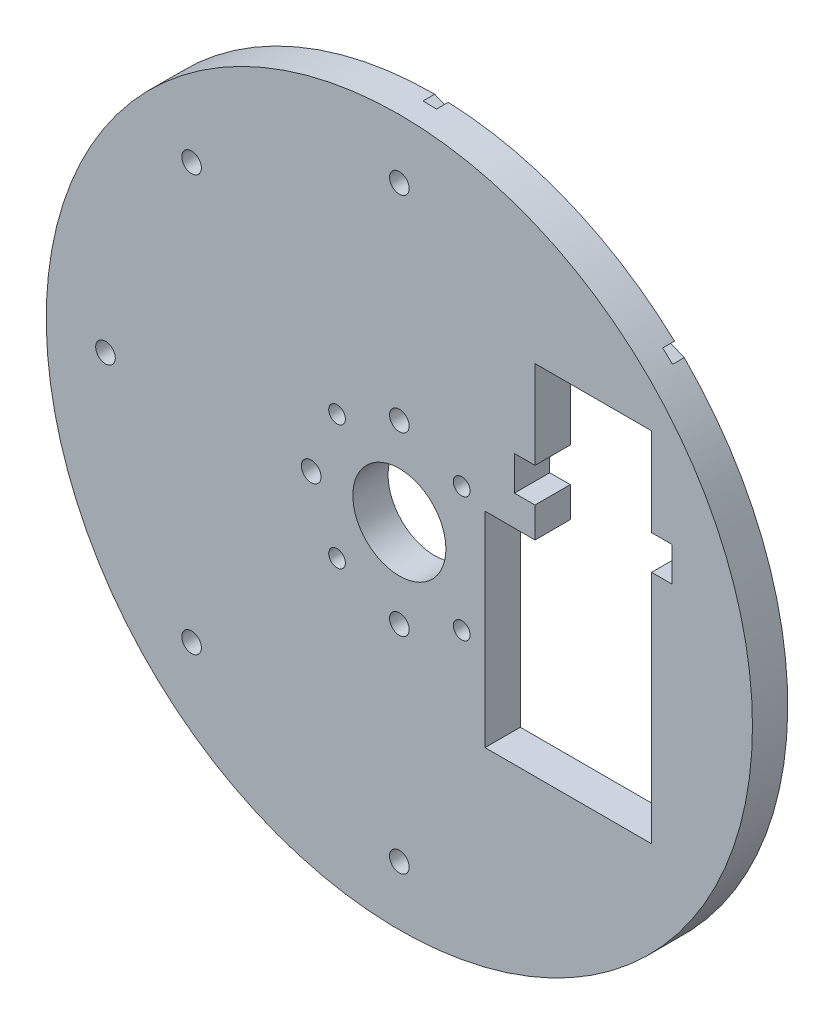
ISO-10303-21;
HEADER;
FILE_DESCRIPTION(('STEP AP214'),'2;1');
FILE_NAME('part.step','',(''),(''),'','','');
FILE_SCHEMA(('AUTOMOTIVE_DESIGN { 1 0 10303 214 1 1 1 1 }'));
ENDSEC;
DATA;
#1=APPLICATION_CONTEXT('core data for automotive mechanical design processes');
#2=APPLICATION_PROTOCOL_DEFINITION('international standard','automotive_design',2000,#1);
#3=PRODUCT_CONTEXT('',#1,'mechanical');
#4=PRODUCT('Part','Part','',(#3));
#5=PRODUCT_RELATED_PRODUCT_CATEGORY('part','',(#4));
#6=PRODUCT_DEFINITION_FORMATION('','',#4);
#7=PRODUCT_DEFINITION_CONTEXT('part definition',#1,'design');
#8=PRODUCT_DEFINITION('design','',#6,#7);
#9=PRODUCT_DEFINITION_SHAPE('','',#8);
#10=(LENGTH_UNIT() NAMED_UNIT(*) SI_UNIT(.MILLI.,.METRE.));
#11=(NAMED_UNIT(*) PLANE_ANGLE_UNIT() SI_UNIT($,.RADIAN.));
#12=(NAMED_UNIT(*) SI_UNIT($,.STERADIAN.) SOLID_ANGLE_UNIT());
#13=UNCERTAINTY_MEASURE_WITH_UNIT(LENGTH_MEASURE(1.E-05),#10,'distance_accuracy_value','');
#14=(GEOMETRIC_REPRESENTATION_CONTEXT(3) GLOBAL_UNCERTAINTY_ASSIGNED_CONTEXT((#13)) GLOBAL_UNIT_ASSIGNED_CONTEXT((#10,
#11,#12)) REPRESENTATION_CONTEXT('',''));
#15=CARTESIAN_POINT('',(0.,0.,0.));
#16=DIRECTION('',(0.,0.,1.));
#17=DIRECTION('',(1.,0.,0.));
#18=AXIS2_PLACEMENT_3D('',#15,#16,#17);
#19=CARTESIAN_POINT('',(0.,0.,0.));
#20=DIRECTION('',(0.,0.,1.));
#21=DIRECTION('',(1.,0.,0.));
#22=AXIS2_PLACEMENT_3D('',#19,#20,#21);
#23=PLANE('',#22);
#24=CARTESIAN_POINT('',(0.,0.,0.));
#25=DIRECTION('',(0.,0.,1.));
#26=DIRECTION('',(1.,0.,0.));
#27=AXIS2_PLACEMENT_3D('',#24,#25,#26);
#28=CIRCLE('',#27,60.08);
#29=CARTESIAN_POINT('',(40.8115144155926,44.0911180523456,0.));
#30=VERTEX_POINT('',#29);
#31=CARTESIAN_POINT('',(2.31902997115174,60.0352271586683,0.));
#32=VERTEX_POINT('',#31);
#33=EDGE_CURVE('E198',#30,#32,#28,.T.);
#34=ORIENTED_EDGE('',*,*,#33,.F.);
#35=DIRECTION('',(0.923879532511288,-0.382683432365087,0.));
#36=VECTOR('',#35,1.);
#37=CARTESIAN_POINT('',(42.7119362037879,43.3039375734458,0.));
#38=LINE('',#37,#36);
#39=EDGE_CURVE('E766',#32,#30,#38,.T.);
#40=ORIENTED_EDGE('',*,*,#39,.F.);
#41=EDGE_LOOP('',(#34,#40));
#42=FACE_BOUND('',#41,.T.);
#43=ADVANCED_FACE('F33',(#42),#23,.F.);
#44=CARTESIAN_POINT('',(0.,0.,6.));
#45=DIRECTION('',(0.,0.,1.));
#46=DIRECTION('',(1.,0.,0.));
#47=AXIS2_PLACEMENT_3D('',#44,#45,#46);
#48=PLANE('',#47);
#49=DIRECTION('',(0.,-1.,0.));
#50=VECTOR('',#49,1.);
#51=CARTESIAN_POINT('',(42.92,-26.,6.));
#52=LINE('',#51,#50);
#53=CARTESIAN_POINT('',(42.92,14.08,6.));
#54=VERTEX_POINT('',#53);
#55=CARTESIAN_POINT('',(42.92,-25.92,6.));
#56=VERTEX_POINT('',#55);
#57=EDGE_CURVE('E173',#54,#56,#52,.T.);
#58=ORIENTED_EDGE('',*,*,#57,.T.);
#59=DIRECTION('',(-1.,0.,0.));
#60=VECTOR('',#59,1.);
#61=CARTESIAN_POINT('',(23.,-25.92,6.));
#62=LINE('',#61,#60);
#63=CARTESIAN_POINT('',(14.58,-25.92,6.));
#64=VERTEX_POINT('',#63);
#65=EDGE_CURVE('E180',#56,#64,#62,.T.);
#66=ORIENTED_EDGE('',*,*,#65,.T.);
#67=DIRECTION('',(0.,1.,0.));
#68=VECTOR('',#67,1.);
#69=CARTESIAN_POINT('',(14.58,9.00000000000001,6.));
#70=LINE('',#69,#68);
#71=CARTESIAN_POINT('',(14.58,8.92000000000001,6.));
#72=VERTEX_POINT('',#71);
#73=EDGE_CURVE('E278',#64,#72,#70,.T.);
#74=ORIENTED_EDGE('',*,*,#73,.T.);
#75=DIRECTION('',(1.,0.,0.));
#76=VECTOR('',#75,1.);
#77=CARTESIAN_POINT('',(23.,8.92,6.));
#78=LINE('',#77,#76);
#79=CARTESIAN_POINT('',(23.08,8.92,6.));
#80=VERTEX_POINT('',#79);
#81=EDGE_CURVE('E281',#72,#80,#78,.T.);
#82=ORIENTED_EDGE('',*,*,#81,.T.);
#83=DIRECTION('',(0.,1.,0.));
#84=VECTOR('',#83,1.);
#85=CARTESIAN_POINT('',(23.08,9.,6.));
#86=LINE('',#85,#84);
#87=CARTESIAN_POINT('',(23.08,14.08,6.));
#88=VERTEX_POINT('',#87);
#89=EDGE_CURVE('E284',#80,#88,#86,.T.);
#90=ORIENTED_EDGE('',*,*,#89,.T.);
#91=DIRECTION('',(-1.,0.,0.));
#92=VECTOR('',#91,1.);
#93=CARTESIAN_POINT('',(23.,14.08,6.));
#94=LINE('',#93,#92);
#95=CARTESIAN_POINT('',(19.58,14.08,6.));
#96=VERTEX_POINT('',#95);
#97=EDGE_CURVE('E287',#88,#96,#94,.T.);
#98=ORIENTED_EDGE('',*,*,#97,.T.);
#99=DIRECTION('',(0.,1.,0.));
#100=VECTOR('',#99,1.);
#101=CARTESIAN_POINT('',(19.58,14.,6.));
#102=LINE('',#101,#100);
#103=CARTESIAN_POINT('',(19.58,19.92,6.));
#104=VERTEX_POINT('',#103);
#105=EDGE_CURVE('E290',#96,#104,#102,.T.);
#106=ORIENTED_EDGE('',*,*,#105,.T.);
#107=DIRECTION('',(1.,0.,0.));
#108=VECTOR('',#107,1.);
#109=CARTESIAN_POINT('',(19.5,19.92,6.));
#110=LINE('',#109,#108);
#111=CARTESIAN_POINT('',(23.08,19.92,6.));
#112=VERTEX_POINT('',#111);
#113=EDGE_CURVE('E293',#104,#112,#110,.T.);
#114=ORIENTED_EDGE('',*,*,#113,.T.);
#115=DIRECTION('',(0.,1.,0.));
#116=VECTOR('',#115,1.);
#117=CARTESIAN_POINT('',(23.08,20.,6.));
#118=LINE('',#117,#116);
#119=CARTESIAN_POINT('',(23.08,34.92,6.));
#120=VERTEX_POINT('',#119);
#121=EDGE_CURVE('E296',#112,#120,#118,.T.);
#122=ORIENTED_EDGE('',*,*,#121,.T.);
#123=DIRECTION('',(1.,0.,0.));
#124=VECTOR('',#123,1.);
#125=CARTESIAN_POINT('',(23.,34.92,6.));
#126=LINE('',#125,#124);
#127=CARTESIAN_POINT('',(42.92,34.92,6.));
#128=VERTEX_POINT('',#127);
#129=EDGE_CURVE('E299',#120,#128,#126,.T.);
#130=ORIENTED_EDGE('',*,*,#129,.T.);
#131=DIRECTION('',(0.,-1.,0.));
#132=VECTOR('',#131,1.);
#133=CARTESIAN_POINT('',(42.92,35.,6.));
#134=LINE('',#133,#132);
#135=CARTESIAN_POINT('',(42.92,19.92,6.));
#136=VERTEX_POINT('',#135);
#137=EDGE_CURVE('E302',#128,#136,#134,.T.);
#138=ORIENTED_EDGE('',*,*,#137,.T.);
#139=DIRECTION('',(1.,0.,0.));
#140=VECTOR('',#139,1.);
#141=CARTESIAN_POINT('',(43.,19.92,6.));
#142=LINE('',#141,#140);
#143=CARTESIAN_POINT('',(46.42,19.92,6.));
#144=VERTEX_POINT('',#143);
#145=EDGE_CURVE('E189',#136,#144,#142,.T.);
#146=ORIENTED_EDGE('',*,*,#145,.T.);
#147=DIRECTION('',(0.,-1.,0.));
#148=VECTOR('',#147,1.);
#149=CARTESIAN_POINT('',(46.42,20.,6.));
#150=LINE('',#149,#148);
#151=CARTESIAN_POINT('',(46.42,14.08,6.));
#152=VERTEX_POINT('',#151);
#153=EDGE_CURVE('E185',#144,#152,#150,.T.);
#154=ORIENTED_EDGE('',*,*,#153,.T.);
#155=DIRECTION('',(-1.,0.,0.));
#156=VECTOR('',#155,1.);
#157=CARTESIAN_POINT('',(46.5,14.08,6.));
#158=LINE('',#157,#156);
#159=EDGE_CURVE('E164',#152,#54,#158,.T.);
#160=ORIENTED_EDGE('',*,*,#159,.T.);
#161=EDGE_LOOP('',(#58,#66,#74,#82,#90,#98,#106,#114,#122,#130,#138,#146,#154,#160));
#162=FACE_BOUND('',#161,.T.);
#163=CARTESIAN_POINT('',(-35.3553390593272,35.3553390593276,6.));
#164=DIRECTION('',(0.,0.,1.));
#165=DIRECTION('',(1.,0.,0.));
#166=AXIS2_PLACEMENT_3D('',#163,#164,#165);
#167=CIRCLE('',#166,1.67);
#168=CARTESIAN_POINT('',(-33.6853390593272,35.3553390593276,6.));
#169=VERTEX_POINT('',#168);
#170=EDGE_CURVE('E396',#169,#169,#167,.T.);
#171=ORIENTED_EDGE('',*,*,#170,.F.);
#172=EDGE_LOOP('',(#171));
#173=FACE_BOUND('',#172,.T.);
#174=CARTESIAN_POINT('',(10.6066017177983,10.6066017177981,6.));
#175=DIRECTION('',(0.,0.,1.));
#176=DIRECTION('',(1.,0.,0.));
#177=AXIS2_PLACEMENT_3D('',#174,#175,#176);
#178=CIRCLE('',#177,1.42);
#179=CARTESIAN_POINT('',(12.0266017177983,10.6066017177981,6.));
#180=VERTEX_POINT('',#179);
#181=EDGE_CURVE('E404',#180,#180,#178,.T.);
#182=ORIENTED_EDGE('',*,*,#181,.F.);
#183=EDGE_LOOP('',(#182));
#184=FACE_BOUND('',#183,.T.);
#185=CARTESIAN_POINT('',(1.04744440165294E-13,15.,6.));
#186=DIRECTION('',(0.,0.,1.));
#187=DIRECTION('',(1.,0.,0.));
#188=AXIS2_PLACEMENT_3D('',#185,#186,#187);
#189=CIRCLE('',#188,1.67);
#190=CARTESIAN_POINT('',(1.6700000000001,15.,6.));
#191=VERTEX_POINT('',#190);
#192=EDGE_CURVE('E412',#191,#191,#189,.T.);
#193=ORIENTED_EDGE('',*,*,#192,.F.);
#194=EDGE_LOOP('',(#193));
#195=FACE_BOUND('',#194,.T.);
#196=CARTESIAN_POINT('',(-15.,0.,6.));
#197=DIRECTION('',(0.,0.,1.));
#198=DIRECTION('',(1.,0.,0.));
#199=AXIS2_PLACEMENT_3D('',#196,#197,#198);
#200=CIRCLE('',#199,1.67);
#201=CARTESIAN_POINT('',(-13.33,0.,6.));
#202=VERTEX_POINT('',#201);
#203=EDGE_CURVE('E420',#202,#202,#200,.T.);
#204=ORIENTED_EDGE('',*,*,#203,.F.);
#205=EDGE_LOOP('',(#204));
#206=FACE_BOUND('',#205,.T.);
#207=CARTESIAN_POINT('',(0.,-50.,6.));
#208=DIRECTION('',(0.,0.,1.));
#209=DIRECTION('',(1.,0.,0.));
#210=AXIS2_PLACEMENT_3D('',#207,#208,#209);
#211=CIRCLE('',#210,1.67);
#212=CARTESIAN_POINT('',(1.67,-50.,6.));
#213=VERTEX_POINT('',#212);
#214=EDGE_CURVE('E428',#213,#213,#211,.T.);
#215=ORIENTED_EDGE('',*,*,#214,.F.);
#216=EDGE_LOOP('',(#215));
#217=FACE_BOUND('',#216,.T.);
#218=CARTESIAN_POINT('',(0.,-15.,6.));
#219=DIRECTION('',(0.,0.,1.));
#220=DIRECTION('',(1.,0.,0.));
#221=AXIS2_PLACEMENT_3D('',#218,#219,#220);
#222=CIRCLE('',#221,1.67);
#223=CARTESIAN_POINT('',(1.67,-15.,6.));
#224=VERTEX_POINT('',#223);
#225=EDGE_CURVE('E201',#224,#224,#222,.T.);
#226=ORIENTED_EDGE('',*,*,#225,.F.);
#227=EDGE_LOOP('',(#226));
#228=FACE_BOUND('',#227,.T.);
#229=CARTESIAN_POINT('',(0.,0.,6.));
#230=DIRECTION('',(0.,0.,1.));
#231=DIRECTION('',(1.,0.,0.));
#232=AXIS2_PLACEMENT_3D('',#229,#230,#231);
#233=CIRCLE('',#232,60.08);
#234=CARTESIAN_POINT('',(60.08,0.,6.));
#235=VERTEX_POINT('',#234);
#236=EDGE_CURVE('E781',#235,#235,#233,.T.);
#237=ORIENTED_EDGE('',*,*,#236,.T.);
#238=EDGE_LOOP('',(#237));
#239=FACE_BOUND('',#238,.T.);
#240=CARTESIAN_POINT('',(0.,0.,6.));
#241=DIRECTION('',(0.,0.,1.));
#242=DIRECTION('',(1.,0.,0.));
#243=AXIS2_PLACEMENT_3D('',#240,#241,#242);
#244=CIRCLE('',#243,7.92);
#245=CARTESIAN_POINT('',(7.92,0.,6.));
#246=VERTEX_POINT('',#245);
#247=EDGE_CURVE('E192',#246,#246,#244,.T.);
#248=ORIENTED_EDGE('',*,*,#247,.F.);
#249=EDGE_LOOP('',(#248));
#250=FACE_BOUND('',#249,.T.);
#251=CARTESIAN_POINT('',(10.6066017177982,-10.6066017177982,6.));
#252=DIRECTION('',(0.,0.,1.));
#253=DIRECTION('',(1.,0.,0.));
#254=AXIS2_PLACEMENT_3D('',#251,#252,#253);
#255=CIRCLE('',#254,1.42);
#256=CARTESIAN_POINT('',(12.0266017177982,-10.6066017177982,6.));
#257=VERTEX_POINT('',#256);
#258=EDGE_CURVE('E210',#257,#257,#255,.T.);
#259=ORIENTED_EDGE('',*,*,#258,.F.);
#260=EDGE_LOOP('',(#259));
#261=FACE_BOUND('',#260,.T.);
#262=CARTESIAN_POINT('',(-35.3553390593274,-35.3553390593273,6.));
#263=DIRECTION('',(0.,0.,1.));
#264=DIRECTION('',(1.,0.,0.));
#265=AXIS2_PLACEMENT_3D('',#262,#263,#264);
#266=CIRCLE('',#265,1.67);
#267=CARTESIAN_POINT('',(-33.6853390593274,-35.3553390593273,6.));
#268=VERTEX_POINT('',#267);
#269=EDGE_CURVE('E424',#268,#268,#266,.T.);
#270=ORIENTED_EDGE('',*,*,#269,.F.);
#271=EDGE_LOOP('',(#270));
#272=FACE_BOUND('',#271,.T.);
#273=CARTESIAN_POINT('',(-10.6066017177982,-10.6066017177982,6.));
#274=DIRECTION('',(0.,0.,1.));
#275=DIRECTION('',(1.,0.,0.));
#276=AXIS2_PLACEMENT_3D('',#273,#274,#275);
#277=CIRCLE('',#276,1.42);
#278=CARTESIAN_POINT('',(-9.18660171779823,-10.6066017177982,6.));
#279=VERTEX_POINT('',#278);
#280=EDGE_CURVE('E416',#279,#279,#277,.T.);
#281=ORIENTED_EDGE('',*,*,#280,.F.);
#282=EDGE_LOOP('',(#281));
#283=FACE_BOUND('',#282,.T.);
#284=CARTESIAN_POINT('',(-10.6066017177982,10.6066017177983,6.));
#285=DIRECTION('',(0.,0.,1.));
#286=DIRECTION('',(1.,0.,0.));
#287=AXIS2_PLACEMENT_3D('',#284,#285,#286);
#288=CIRCLE('',#287,1.42);
#289=CARTESIAN_POINT('',(-9.18660171779816,10.6066017177983,6.));
#290=VERTEX_POINT('',#289);
#291=EDGE_CURVE('E408',#290,#290,#288,.T.);
#292=ORIENTED_EDGE('',*,*,#291,.F.);
#293=EDGE_LOOP('',(#292));
#294=FACE_BOUND('',#293,.T.);
#295=CARTESIAN_POINT('',(-50.,1.74574066942157E-13,6.));
#296=DIRECTION('',(0.,0.,1.));
#297=DIRECTION('',(1.,0.,0.));
#298=AXIS2_PLACEMENT_3D('',#295,#296,#297);
#299=CIRCLE('',#298,1.67);
#300=CARTESIAN_POINT('',(-48.33,1.74574066942157E-13,6.));
#301=VERTEX_POINT('',#300);
#302=EDGE_CURVE('E400',#301,#301,#299,.T.);
#303=ORIENTED_EDGE('',*,*,#302,.F.);
#304=EDGE_LOOP('',(#303));
#305=FACE_BOUND('',#304,.T.);
#306=CARTESIAN_POINT('',(1.68358407260694E-13,50.,6.));
#307=DIRECTION('',(0.,0.,1.));
#308=DIRECTION('',(1.,0.,0.));
#309=AXIS2_PLACEMENT_3D('',#306,#307,#308);
#310=CIRCLE('',#309,1.67);
#311=CARTESIAN_POINT('',(1.67000000000017,50.,6.));
#312=VERTEX_POINT('',#311);
#313=EDGE_CURVE('E390',#312,#312,#310,.T.);
#314=ORIENTED_EDGE('',*,*,#313,.F.);
#315=EDGE_LOOP('',(#314));
#316=FACE_BOUND('',#315,.T.);
#317=ADVANCED_FACE('F182',(#162,#173,#184,#195,#206,#217,#228,#239,#250,#261,#272,#283,#294,
#305,#316),#48,.T.);
#318=DIRECTION('',(-1.,0.,0.));
#319=VECTOR('',#318,1.);
#320=CARTESIAN_POINT('',(23.,-25.92,0.));
#321=LINE('',#320,#319);
#322=CARTESIAN_POINT('',(42.92,-25.92,0.));
#323=VERTEX_POINT('',#322);
#324=CARTESIAN_POINT('',(14.58,-25.92,0.));
#325=VERTEX_POINT('',#324);
#326=EDGE_CURVE('E240',#323,#325,#321,.T.);
#327=ORIENTED_EDGE('',*,*,#326,.F.);
#328=DIRECTION('',(0.,-1.,0.));
#329=VECTOR('',#328,1.);
#330=CARTESIAN_POINT('',(42.92,-26.,0.));
#331=LINE('',#330,#329);
#332=CARTESIAN_POINT('',(42.92,14.08,0.));
#333=VERTEX_POINT('',#332);
#334=EDGE_CURVE('E238',#333,#323,#331,.T.);
#335=ORIENTED_EDGE('',*,*,#334,.F.);
#336=DIRECTION('',(-1.,0.,0.));
#337=VECTOR('',#336,1.);
#338=CARTESIAN_POINT('',(46.5,14.08,0.));
#339=LINE('',#338,#337);
#340=CARTESIAN_POINT('',(46.42,14.08,0.));
#341=VERTEX_POINT('',#340);
#342=EDGE_CURVE('E167',#341,#333,#339,.T.);
#343=ORIENTED_EDGE('',*,*,#342,.F.);
#344=DIRECTION('',(0.,-1.,0.));
#345=VECTOR('',#344,1.);
#346=CARTESIAN_POINT('',(46.42,20.,0.));
#347=LINE('',#346,#345);
#348=CARTESIAN_POINT('',(46.42,19.92,0.));
#349=VERTEX_POINT('',#348);
#350=EDGE_CURVE('E243',#349,#341,#347,.T.);
#351=ORIENTED_EDGE('',*,*,#350,.F.);
#352=DIRECTION('',(1.,0.,0.));
#353=VECTOR('',#352,1.);
#354=CARTESIAN_POINT('',(43.,19.92,0.));
#355=LINE('',#354,#353);
#356=CARTESIAN_POINT('',(42.92,19.92,0.));
#357=VERTEX_POINT('',#356);
#358=EDGE_CURVE('E245',#357,#349,#355,.T.);
#359=ORIENTED_EDGE('',*,*,#358,.F.);
#360=DIRECTION('',(0.,-1.,0.));
#361=VECTOR('',#360,1.);
#362=CARTESIAN_POINT('',(42.92,35.,0.));
#363=LINE('',#362,#361);
#364=CARTESIAN_POINT('',(42.92,34.92,0.));
#365=VERTEX_POINT('',#364);
#366=EDGE_CURVE('E248',#365,#357,#363,.T.);
#367=ORIENTED_EDGE('',*,*,#366,.F.);
#368=DIRECTION('',(1.,0.,0.));
#369=VECTOR('',#368,1.);
#370=CARTESIAN_POINT('',(23.,34.92,0.));
#371=LINE('',#370,#369);
#372=CARTESIAN_POINT('',(23.08,34.92,0.));
#373=VERTEX_POINT('',#372);
#374=EDGE_CURVE('E251',#373,#365,#371,.T.);
#375=ORIENTED_EDGE('',*,*,#374,.F.);
#376=DIRECTION('',(0.,1.,0.));
#377=VECTOR('',#376,1.);
#378=CARTESIAN_POINT('',(23.08,20.,0.));
#379=LINE('',#378,#377);
#380=CARTESIAN_POINT('',(23.08,19.92,0.));
#381=VERTEX_POINT('',#380);
#382=EDGE_CURVE('E254',#381,#373,#379,.T.);
#383=ORIENTED_EDGE('',*,*,#382,.F.);
#384=DIRECTION('',(1.,0.,0.));
#385=VECTOR('',#384,1.);
#386=CARTESIAN_POINT('',(19.5,19.92,0.));
#387=LINE('',#386,#385);
#388=CARTESIAN_POINT('',(19.58,19.92,0.));
#389=VERTEX_POINT('',#388);
#390=EDGE_CURVE('E257',#389,#381,#387,.T.);
#391=ORIENTED_EDGE('',*,*,#390,.F.);
#392=DIRECTION('',(0.,1.,0.));
#393=VECTOR('',#392,1.);
#394=CARTESIAN_POINT('',(19.58,14.,0.));
#395=LINE('',#394,#393);
#396=CARTESIAN_POINT('',(19.58,14.08,0.));
#397=VERTEX_POINT('',#396);
#398=EDGE_CURVE('E260',#397,#389,#395,.T.);
#399=ORIENTED_EDGE('',*,*,#398,.F.);
#400=DIRECTION('',(-1.,0.,0.));
#401=VECTOR('',#400,1.);
#402=CARTESIAN_POINT('',(23.,14.08,0.));
#403=LINE('',#402,#401);
#404=CARTESIAN_POINT('',(23.08,14.08,0.));
#405=VERTEX_POINT('',#404);
#406=EDGE_CURVE('E263',#405,#397,#403,.T.);
#407=ORIENTED_EDGE('',*,*,#406,.F.);
#408=DIRECTION('',(0.,1.,0.));
#409=VECTOR('',#408,1.);
#410=CARTESIAN_POINT('',(23.08,9.,0.));
#411=LINE('',#410,#409);
#412=CARTESIAN_POINT('',(23.08,8.92,0.));
#413=VERTEX_POINT('',#412);
#414=EDGE_CURVE('E266',#413,#405,#411,.T.);
#415=ORIENTED_EDGE('',*,*,#414,.F.);
#416=DIRECTION('',(1.,0.,0.));
#417=VECTOR('',#416,1.);
#418=CARTESIAN_POINT('',(23.,8.92,0.));
#419=LINE('',#418,#417);
#420=CARTESIAN_POINT('',(14.58,8.92000000000001,0.));
#421=VERTEX_POINT('',#420);
#422=EDGE_CURVE('E269',#421,#413,#419,.T.);
#423=ORIENTED_EDGE('',*,*,#422,.F.);
#424=DIRECTION('',(0.,1.,0.));
#425=VECTOR('',#424,1.);
#426=CARTESIAN_POINT('',(14.58,9.00000000000001,0.));
#427=LINE('',#426,#425);
#428=EDGE_CURVE('E272',#325,#421,#427,.T.);
#429=ORIENTED_EDGE('',*,*,#428,.F.);
#430=EDGE_LOOP('',(#327,#335,#343,#351,#359,#367,#375,#383,#391,#399,#407,#415,#423,#429));
#431=FACE_BOUND('',#430,.T.);
#432=CARTESIAN_POINT('',(-35.3553390593272,35.3553390593276,0.));
#433=DIRECTION('',(0.,0.,1.));
#434=DIRECTION('',(1.,0.,0.));
#435=AXIS2_PLACEMENT_3D('',#432,#433,#434);
#436=CIRCLE('',#435,1.67);
#437=CARTESIAN_POINT('',(-33.6853390593272,35.3553390593276,0.));
#438=VERTEX_POINT('',#437);
#439=EDGE_CURVE('E346',#438,#438,#436,.T.);
#440=ORIENTED_EDGE('',*,*,#439,.T.);
#441=EDGE_LOOP('',(#440));
#442=FACE_BOUND('',#441,.T.);
#443=CARTESIAN_POINT('',(10.6066017177983,10.6066017177981,0.));
#444=DIRECTION('',(0.,0.,1.));
#445=DIRECTION('',(1.,0.,0.));
#446=AXIS2_PLACEMENT_3D('',#443,#444,#445);
#447=CIRCLE('',#446,1.42);
#448=CARTESIAN_POINT('',(12.0266017177983,10.6066017177981,0.));
#449=VERTEX_POINT('',#448);
#450=EDGE_CURVE('E350',#449,#449,#447,.T.);
#451=ORIENTED_EDGE('',*,*,#450,.T.);
#452=EDGE_LOOP('',(#451));
#453=FACE_BOUND('',#452,.T.);
#454=CARTESIAN_POINT('',(1.04744440165294E-13,15.,0.));
#455=DIRECTION('',(0.,0.,1.));
#456=DIRECTION('',(1.,0.,0.));
#457=AXIS2_PLACEMENT_3D('',#454,#455,#456);
#458=CIRCLE('',#457,1.67);
#459=CARTESIAN_POINT('',(1.6700000000001,15.,0.));
#460=VERTEX_POINT('',#459);
#461=EDGE_CURVE('E354',#460,#460,#458,.T.);
#462=ORIENTED_EDGE('',*,*,#461,.T.);
#463=EDGE_LOOP('',(#462));
#464=FACE_BOUND('',#463,.T.);
#465=CARTESIAN_POINT('',(-15.,0.,0.));
#466=DIRECTION('',(0.,0.,1.));
#467=DIRECTION('',(1.,0.,0.));
#468=AXIS2_PLACEMENT_3D('',#465,#466,#467);
#469=CIRCLE('',#468,1.67);
#470=CARTESIAN_POINT('',(-13.33,0.,0.));
#471=VERTEX_POINT('',#470);
#472=EDGE_CURVE('E358',#471,#471,#469,.T.);
#473=ORIENTED_EDGE('',*,*,#472,.T.);
#474=EDGE_LOOP('',(#473));
#475=FACE_BOUND('',#474,.T.);
#476=CARTESIAN_POINT('',(0.,-50.,0.));
#477=DIRECTION('',(0.,0.,1.));
#478=DIRECTION('',(1.,0.,0.));
#479=AXIS2_PLACEMENT_3D('',#476,#477,#478);
#480=CIRCLE('',#479,1.67);
#481=CARTESIAN_POINT('',(1.67,-50.,0.));
#482=VERTEX_POINT('',#481);
#483=EDGE_CURVE('E362',#482,#482,#480,.T.);
#484=ORIENTED_EDGE('',*,*,#483,.T.);
#485=EDGE_LOOP('',(#484));
#486=FACE_BOUND('',#485,.T.);
#487=CARTESIAN_POINT('',(0.,-15.,0.));
#488=DIRECTION('',(0.,0.,1.));
#489=DIRECTION('',(1.,0.,0.));
#490=AXIS2_PLACEMENT_3D('',#487,#488,#489);
#491=CIRCLE('',#490,1.67);
#492=CARTESIAN_POINT('',(1.67,-15.,0.));
#493=VERTEX_POINT('',#492);
#494=EDGE_CURVE('E205',#493,#493,#491,.T.);
#495=ORIENTED_EDGE('',*,*,#494,.T.);
#496=EDGE_LOOP('',(#495));
#497=FACE_BOUND('',#496,.T.);
#498=CARTESIAN_POINT('',(0.,0.,0.));
#499=DIRECTION('',(0.,0.,1.));
#500=DIRECTION('',(1.,0.,0.));
#501=AXIS2_PLACEMENT_3D('',#498,#499,#500);
#502=CIRCLE('',#501,60.08);
#503=CARTESIAN_POINT('',(0.015918080320763,60.0799978912676,0.));
#504=VERTEX_POINT('',#503);
#505=CARTESIAN_POINT('',(42.4717181400503,42.4942297051273,0.));
#506=VERTEX_POINT('',#505);
#507=EDGE_CURVE('E194',#504,#506,#502,.T.);
#508=ORIENTED_EDGE('',*,*,#507,.F.);
#509=DIRECTION('',(-0.923879532511288,0.382683432365087,0.));
#510=VECTOR('',#509,1.);
#511=CARTESIAN_POINT('',(42.4570215457818,42.500317233794,0.));
#512=LINE('',#511,#510);
#513=EDGE_CURVE('E761',#506,#504,#512,.T.);
#514=ORIENTED_EDGE('',*,*,#513,.F.);
#515=EDGE_LOOP('',(#508,#514));
#516=FACE_BOUND('',#515,.T.);
#517=CARTESIAN_POINT('',(0.,0.,0.));
#518=DIRECTION('',(0.,0.,1.));
#519=DIRECTION('',(1.,0.,0.));
#520=AXIS2_PLACEMENT_3D('',#517,#518,#519);
#521=CIRCLE('',#520,7.92);
#522=CARTESIAN_POINT('',(7.92,0.,0.));
#523=VERTEX_POINT('',#522);
#524=EDGE_CURVE('E37',#523,#523,#521,.T.);
#525=ORIENTED_EDGE('',*,*,#524,.T.);
#526=EDGE_LOOP('',(#525));
#527=FACE_BOUND('',#526,.T.);
#528=CARTESIAN_POINT('',(10.6066017177982,-10.6066017177982,0.));
#529=DIRECTION('',(0.,0.,1.));
#530=DIRECTION('',(1.,0.,0.));
#531=AXIS2_PLACEMENT_3D('',#528,#529,#530);
#532=CIRCLE('',#531,1.42);
#533=CARTESIAN_POINT('',(12.0266017177982,-10.6066017177982,0.));
#534=VERTEX_POINT('',#533);
#535=EDGE_CURVE('E213',#534,#534,#532,.T.);
#536=ORIENTED_EDGE('',*,*,#535,.T.);
#537=EDGE_LOOP('',(#536));
#538=FACE_BOUND('',#537,.T.);
#539=CARTESIAN_POINT('',(-35.3553390593274,-35.3553390593273,0.));
#540=DIRECTION('',(0.,0.,1.));
#541=DIRECTION('',(1.,0.,0.));
#542=AXIS2_PLACEMENT_3D('',#539,#540,#541);
#543=CIRCLE('',#542,1.67);
#544=CARTESIAN_POINT('',(-33.6853390593274,-35.3553390593273,0.));
#545=VERTEX_POINT('',#544);
#546=EDGE_CURVE('E374',#545,#545,#543,.T.);
#547=ORIENTED_EDGE('',*,*,#546,.T.);
#548=EDGE_LOOP('',(#547));
#549=FACE_BOUND('',#548,.T.);
#550=CARTESIAN_POINT('',(-10.6066017177982,-10.6066017177982,0.));
#551=DIRECTION('',(0.,0.,1.));
#552=DIRECTION('',(1.,0.,0.));
#553=AXIS2_PLACEMENT_3D('',#550,#551,#552);
#554=CIRCLE('',#553,1.42);
#555=CARTESIAN_POINT('',(-9.18660171779823,-10.6066017177982,0.));
#556=VERTEX_POINT('',#555);
#557=EDGE_CURVE('E378',#556,#556,#554,.T.);
#558=ORIENTED_EDGE('',*,*,#557,.T.);
#559=EDGE_LOOP('',(#558));
#560=FACE_BOUND('',#559,.T.);
#561=CARTESIAN_POINT('',(-10.6066017177982,10.6066017177983,0.));
#562=DIRECTION('',(0.,0.,1.));
#563=DIRECTION('',(1.,0.,0.));
#564=AXIS2_PLACEMENT_3D('',#561,#562,#563);
#565=CIRCLE('',#564,1.42);
#566=CARTESIAN_POINT('',(-9.18660171779816,10.6066017177983,0.));
#567=VERTEX_POINT('',#566);
#568=EDGE_CURVE('E382',#567,#567,#565,.T.);
#569=ORIENTED_EDGE('',*,*,#568,.T.);
#570=EDGE_LOOP('',(#569));
#571=FACE_BOUND('',#570,.T.);
#572=CARTESIAN_POINT('',(-50.,1.74574066942157E-13,0.));
#573=DIRECTION('',(0.,0.,1.));
#574=DIRECTION('',(1.,0.,0.));
#575=AXIS2_PLACEMENT_3D('',#572,#573,#574);
#576=CIRCLE('',#575,1.67);
#577=CARTESIAN_POINT('',(-48.33,1.74574066942157E-13,0.));
#578=VERTEX_POINT('',#577);
#579=EDGE_CURVE('E386',#578,#578,#576,.T.);
#580=ORIENTED_EDGE('',*,*,#579,.T.);
#581=EDGE_LOOP('',(#580));
#582=FACE_BOUND('',#581,.T.);
#583=CARTESIAN_POINT('',(1.68358407260694E-13,50.,0.));
#584=DIRECTION('',(0.,0.,1.));
#585=DIRECTION('',(1.,0.,0.));
#586=AXIS2_PLACEMENT_3D('',#583,#584,#585);
#587=CIRCLE('',#586,1.67);
#588=CARTESIAN_POINT('',(1.67000000000017,50.,0.));
#589=VERTEX_POINT('',#588);
#590=EDGE_CURVE('E170',#589,#589,#587,.T.);
#591=ORIENTED_EDGE('',*,*,#590,.T.);
#592=EDGE_LOOP('',(#591));
#593=FACE_BOUND('',#592,.T.);
#594=ADVANCED_FACE('F325',(#431,#442,#453,#464,#475,#486,#497,#516,#527,#538,#549,#560,#571,
#582,#593),#23,.F.);
#595=CARTESIAN_POINT('',(0.,0.,6.));
#596=DIRECTION('',(0.,0.,-1.));
#597=DIRECTION('',(-1.,0.,0.));
#598=AXIS2_PLACEMENT_3D('',#595,#596,#597);
#599=CYLINDRICAL_SURFACE('',#598,60.08);
#600=CARTESIAN_POINT('',(0.,0.,2.));
#601=DIRECTION('',(0.,0.,1.));
#602=DIRECTION('',(1.,0.,0.));
#603=AXIS2_PLACEMENT_3D('',#600,#601,#602);
#604=CIRCLE('',#603,60.08);
#605=CARTESIAN_POINT('',(42.4717181400503,42.4942297051273,2.));
#606=VERTEX_POINT('',#605);
#607=CARTESIAN_POINT('',(40.8115144155926,44.0911180523456,2.));
#608=VERTEX_POINT('',#607);
#609=EDGE_CURVE('E43',#606,#608,#604,.T.);
#610=ORIENTED_EDGE('',*,*,#609,.T.);
#611=DIRECTION('',(0.,0.,-1.));
#612=VECTOR('',#611,1.);
#613=CARTESIAN_POINT('',(40.8115144155926,44.0911180523456,2.));
#614=LINE('',#613,#612);
#615=EDGE_CURVE('E12',#608,#30,#614,.T.);
#616=ORIENTED_EDGE('',*,*,#615,.T.);
#617=ORIENTED_EDGE('',*,*,#33,.T.);
#618=DIRECTION('',(0.,0.,-1.));
#619=VECTOR('',#618,1.);
#620=CARTESIAN_POINT('',(2.31902997115174,60.0352271586683,0.));
#621=LINE('',#620,#619);
#622=CARTESIAN_POINT('',(2.31902997115174,60.0352271586683,2.));
#623=VERTEX_POINT('',#622);
#624=EDGE_CURVE('E776',#32,#623,#621,.F.);
#625=ORIENTED_EDGE('',*,*,#624,.T.);
#626=CARTESIAN_POINT('',(0.,0.,2.));
#627=DIRECTION('',(0.,0.,1.));
#628=DIRECTION('',(1.,0.,0.));
#629=AXIS2_PLACEMENT_3D('',#626,#627,#628);
#630=CIRCLE('',#629,60.08);
#631=CARTESIAN_POINT('',(0.0159180803207651,60.0799978912676,2.));
#632=VERTEX_POINT('',#631);
#633=EDGE_CURVE('E771',#623,#632,#630,.T.);
#634=ORIENTED_EDGE('',*,*,#633,.T.);
#635=DIRECTION('',(0.,0.,-1.));
#636=VECTOR('',#635,1.);
#637=CARTESIAN_POINT('',(0.0159180803207651,60.0799978912676,2.));
#638=LINE('',#637,#636);
#639=EDGE_CURVE('E241',#632,#504,#638,.T.);
#640=ORIENTED_EDGE('',*,*,#639,.T.);
#641=ORIENTED_EDGE('',*,*,#507,.T.);
#642=DIRECTION('',(0.,0.,-1.));
#643=VECTOR('',#642,1.);
#644=CARTESIAN_POINT('',(42.4717181400503,42.4942297051273,2.));
#645=LINE('',#644,#643);
#646=EDGE_CURVE('E765',#606,#506,#645,.T.);
#647=ORIENTED_EDGE('',*,*,#646,.F.);
#648=EDGE_LOOP('',(#610,#616,#617,#625,#634,#640,#641,#647));
#649=FACE_BOUND('',#648,.T.);
#650=ORIENTED_EDGE('',*,*,#236,.F.);
#651=EDGE_LOOP('',(#650));
#652=FACE_BOUND('',#651,.T.);
#653=ADVANCED_FACE('F333',(#649,#652),#599,.T.);
#654=CARTESIAN_POINT('',(0.,0.,6.));
#655=DIRECTION('',(0.,0.,-1.));
#656=DIRECTION('',(-1.,0.,0.));
#657=AXIS2_PLACEMENT_3D('',#654,#655,#656);
#658=CYLINDRICAL_SURFACE('',#657,7.92);
#659=ORIENTED_EDGE('',*,*,#247,.T.);
#660=EDGE_LOOP('',(#659));
#661=FACE_BOUND('',#660,.T.);
#662=ORIENTED_EDGE('',*,*,#524,.F.);
#663=EDGE_LOOP('',(#662));
#664=FACE_BOUND('',#663,.T.);
#665=ADVANCED_FACE('F338',(#661,#664),#658,.F.);
#666=CARTESIAN_POINT('',(0.,-15.,6.));
#667=DIRECTION('',(0.,0.,-1.));
#668=DIRECTION('',(-1.,0.,0.));
#669=AXIS2_PLACEMENT_3D('',#666,#667,#668);
#670=CYLINDRICAL_SURFACE('',#669,1.67);
#671=ORIENTED_EDGE('',*,*,#225,.T.);
#672=EDGE_LOOP('',(#671));
#673=FACE_BOUND('',#672,.T.);
#674=ORIENTED_EDGE('',*,*,#494,.F.);
#675=EDGE_LOOP('',(#674));
#676=FACE_BOUND('',#675,.T.);
#677=ADVANCED_FACE('F493',(#673,#676),#670,.F.);
#678=CARTESIAN_POINT('',(10.6066017177982,-10.6066017177982,6.));
#679=DIRECTION('',(0.,0.,-1.));
#680=DIRECTION('',(-1.,0.,0.));
#681=AXIS2_PLACEMENT_3D('',#678,#679,#680);
#682=CYLINDRICAL_SURFACE('',#681,1.42);
#683=ORIENTED_EDGE('',*,*,#258,.T.);
#684=EDGE_LOOP('',(#683));
#685=FACE_BOUND('',#684,.T.);
#686=ORIENTED_EDGE('',*,*,#535,.F.);
#687=EDGE_LOOP('',(#686));
#688=FACE_BOUND('',#687,.T.);
#689=ADVANCED_FACE('F434',(#685,#688),#682,.F.);
#690=CARTESIAN_POINT('',(0.,-50.,6.));
#691=DIRECTION('',(0.,0.,-1.));
#692=DIRECTION('',(-1.,0.,0.));
#693=AXIS2_PLACEMENT_3D('',#690,#691,#692);
#694=CYLINDRICAL_SURFACE('',#693,1.67);
#695=ORIENTED_EDGE('',*,*,#214,.T.);
#696=EDGE_LOOP('',(#695));
#697=FACE_BOUND('',#696,.T.);
#698=ORIENTED_EDGE('',*,*,#483,.F.);
#699=EDGE_LOOP('',(#698));
#700=FACE_BOUND('',#699,.T.);
#701=ADVANCED_FACE('F487',(#697,#700),#694,.F.);
#702=CARTESIAN_POINT('',(-35.3553390593274,-35.3553390593273,6.));
#703=DIRECTION('',(0.,0.,-1.));
#704=DIRECTION('',(-1.,0.,0.));
#705=AXIS2_PLACEMENT_3D('',#702,#703,#704);
#706=CYLINDRICAL_SURFACE('',#705,1.67);
#707=ORIENTED_EDGE('',*,*,#269,.T.);
#708=EDGE_LOOP('',(#707));
#709=FACE_BOUND('',#708,.T.);
#710=ORIENTED_EDGE('',*,*,#546,.F.);
#711=EDGE_LOOP('',(#710));
#712=FACE_BOUND('',#711,.T.);
#713=ADVANCED_FACE('F483',(#709,#712),#706,.F.);
#714=CARTESIAN_POINT('',(-15.,0.,6.));
#715=DIRECTION('',(0.,0.,-1.));
#716=DIRECTION('',(-1.,0.,0.));
#717=AXIS2_PLACEMENT_3D('',#714,#715,#716);
#718=CYLINDRICAL_SURFACE('',#717,1.67);
#719=ORIENTED_EDGE('',*,*,#203,.T.);
#720=EDGE_LOOP('',(#719));
#721=FACE_BOUND('',#720,.T.);
#722=ORIENTED_EDGE('',*,*,#472,.F.);
#723=EDGE_LOOP('',(#722));
#724=FACE_BOUND('',#723,.T.);
#725=ADVANCED_FACE('F479',(#721,#724),#718,.F.);
#726=CARTESIAN_POINT('',(-10.6066017177982,-10.6066017177982,6.));
#727=DIRECTION('',(0.,0.,-1.));
#728=DIRECTION('',(-1.,0.,0.));
#729=AXIS2_PLACEMENT_3D('',#726,#727,#728);
#730=CYLINDRICAL_SURFACE('',#729,1.42);
#731=ORIENTED_EDGE('',*,*,#280,.T.);
#732=EDGE_LOOP('',(#731));
#733=FACE_BOUND('',#732,.T.);
#734=ORIENTED_EDGE('',*,*,#557,.F.);
#735=EDGE_LOOP('',(#734));
#736=FACE_BOUND('',#735,.T.);
#737=ADVANCED_FACE('F475',(#733,#736),#730,.F.);
#738=CARTESIAN_POINT('',(1.04744440165294E-13,15.,6.));
#739=DIRECTION('',(0.,0.,-1.));
#740=DIRECTION('',(-1.,0.,0.));
#741=AXIS2_PLACEMENT_3D('',#738,#739,#740);
#742=CYLINDRICAL_SURFACE('',#741,1.67);
#743=ORIENTED_EDGE('',*,*,#192,.T.);
#744=EDGE_LOOP('',(#743));
#745=FACE_BOUND('',#744,.T.);
#746=ORIENTED_EDGE('',*,*,#461,.F.);
#747=EDGE_LOOP('',(#746));
#748=FACE_BOUND('',#747,.T.);
#749=ADVANCED_FACE('F471',(#745,#748),#742,.F.);
#750=CARTESIAN_POINT('',(-10.6066017177982,10.6066017177983,6.));
#751=DIRECTION('',(0.,0.,-1.));
#752=DIRECTION('',(-1.,0.,0.));
#753=AXIS2_PLACEMENT_3D('',#750,#751,#752);
#754=CYLINDRICAL_SURFACE('',#753,1.42);
#755=ORIENTED_EDGE('',*,*,#291,.T.);
#756=EDGE_LOOP('',(#755));
#757=FACE_BOUND('',#756,.T.);
#758=ORIENTED_EDGE('',*,*,#568,.F.);
#759=EDGE_LOOP('',(#758));
#760=FACE_BOUND('',#759,.T.);
#761=ADVANCED_FACE('F467',(#757,#760),#754,.F.);
#762=CARTESIAN_POINT('',(10.6066017177983,10.6066017177981,6.));
#763=DIRECTION('',(0.,0.,-1.));
#764=DIRECTION('',(-1.,0.,0.));
#765=AXIS2_PLACEMENT_3D('',#762,#763,#764);
#766=CYLINDRICAL_SURFACE('',#765,1.42);
#767=ORIENTED_EDGE('',*,*,#181,.T.);
#768=EDGE_LOOP('',(#767));
#769=FACE_BOUND('',#768,.T.);
#770=ORIENTED_EDGE('',*,*,#450,.F.);
#771=EDGE_LOOP('',(#770));
#772=FACE_BOUND('',#771,.T.);
#773=ADVANCED_FACE('F460',(#769,#772),#766,.F.);
#774=CARTESIAN_POINT('',(-50.,1.74574066942157E-13,6.));
#775=DIRECTION('',(0.,0.,-1.));
#776=DIRECTION('',(-1.,0.,0.));
#777=AXIS2_PLACEMENT_3D('',#774,#775,#776);
#778=CYLINDRICAL_SURFACE('',#777,1.67);
#779=ORIENTED_EDGE('',*,*,#302,.T.);
#780=EDGE_LOOP('',(#779));
#781=FACE_BOUND('',#780,.T.);
#782=ORIENTED_EDGE('',*,*,#579,.F.);
#783=EDGE_LOOP('',(#782));
#784=FACE_BOUND('',#783,.T.);
#785=ADVANCED_FACE('F455',(#781,#784),#778,.F.);
#786=CARTESIAN_POINT('',(-35.3553390593272,35.3553390593276,6.));
#787=DIRECTION('',(0.,0.,-1.));
#788=DIRECTION('',(-1.,0.,0.));
#789=AXIS2_PLACEMENT_3D('',#786,#787,#788);
#790=CYLINDRICAL_SURFACE('',#789,1.67);
#791=ORIENTED_EDGE('',*,*,#170,.T.);
#792=EDGE_LOOP('',(#791));
#793=FACE_BOUND('',#792,.T.);
#794=ORIENTED_EDGE('',*,*,#439,.F.);
#795=EDGE_LOOP('',(#794));
#796=FACE_BOUND('',#795,.T.);
#797=ADVANCED_FACE('F449',(#793,#796),#790,.F.);
#798=CARTESIAN_POINT('',(1.68358407260694E-13,50.,6.));
#799=DIRECTION('',(0.,0.,-1.));
#800=DIRECTION('',(-1.,0.,0.));
#801=AXIS2_PLACEMENT_3D('',#798,#799,#800);
#802=CYLINDRICAL_SURFACE('',#801,1.67);
#803=ORIENTED_EDGE('',*,*,#313,.T.);
#804=EDGE_LOOP('',(#803));
#805=FACE_BOUND('',#804,.T.);
#806=ORIENTED_EDGE('',*,*,#590,.F.);
#807=EDGE_LOOP('',(#806));
#808=FACE_BOUND('',#807,.T.);
#809=ADVANCED_FACE('F35',(#805,#808),#802,.F.);
#810=CARTESIAN_POINT('',(42.92,-26.,6.));
#811=DIRECTION('',(1.,0.,0.));
#812=DIRECTION('',(0.,0.,-1.));
#813=AXIS2_PLACEMENT_3D('',#810,#811,#812);
#814=PLANE('',#813);
#815=ORIENTED_EDGE('',*,*,#334,.T.);
#816=DIRECTION('',(0.,0.,-1.));
#817=VECTOR('',#816,1.);
#818=CARTESIAN_POINT('',(42.92,-25.92,6.));
#819=LINE('',#818,#817);
#820=EDGE_CURVE('E176',#56,#323,#819,.T.);
#821=ORIENTED_EDGE('',*,*,#820,.F.);
#822=ORIENTED_EDGE('',*,*,#57,.F.);
#823=DIRECTION('',(0.,0.,-1.));
#824=VECTOR('',#823,1.);
#825=CARTESIAN_POINT('',(42.92,14.08,6.));
#826=LINE('',#825,#824);
#827=EDGE_CURVE('E160',#54,#333,#826,.T.);
#828=ORIENTED_EDGE('',*,*,#827,.T.);
#829=EDGE_LOOP('',(#815,#821,#822,#828));
#830=FACE_BOUND('',#829,.T.);
#831=ADVANCED_FACE('F174',(#830),#814,.F.);
#832=CARTESIAN_POINT('',(46.5,14.08,6.));
#833=DIRECTION('',(0.,-1.,0.));
#834=DIRECTION('',(0.,0.,-1.));
#835=AXIS2_PLACEMENT_3D('',#832,#833,#834);
#836=PLANE('',#835);
#837=ORIENTED_EDGE('',*,*,#342,.T.);
#838=ORIENTED_EDGE('',*,*,#827,.F.);
#839=ORIENTED_EDGE('',*,*,#159,.F.);
#840=DIRECTION('',(0.,0.,-1.));
#841=VECTOR('',#840,1.);
#842=CARTESIAN_POINT('',(46.42,14.08,6.));
#843=LINE('',#842,#841);
#844=EDGE_CURVE('E155',#152,#341,#843,.T.);
#845=ORIENTED_EDGE('',*,*,#844,.T.);
#846=EDGE_LOOP('',(#837,#838,#839,#845));
#847=FACE_BOUND('',#846,.T.);
#848=ADVANCED_FACE('F162',(#847),#836,.F.);
#849=CARTESIAN_POINT('',(46.42,20.,6.));
#850=DIRECTION('',(1.,0.,0.));
#851=DIRECTION('',(0.,0.,-1.));
#852=AXIS2_PLACEMENT_3D('',#849,#850,#851);
#853=PLANE('',#852);
#854=ORIENTED_EDGE('',*,*,#350,.T.);
#855=ORIENTED_EDGE('',*,*,#844,.F.);
#856=ORIENTED_EDGE('',*,*,#153,.F.);
#857=DIRECTION('',(0.,0.,-1.));
#858=VECTOR('',#857,1.);
#859=CARTESIAN_POINT('',(46.42,19.92,6.));
#860=LINE('',#859,#858);
#861=EDGE_CURVE('E235',#144,#349,#860,.T.);
#862=ORIENTED_EDGE('',*,*,#861,.T.);
#863=EDGE_LOOP('',(#854,#855,#856,#862));
#864=FACE_BOUND('',#863,.T.);
#865=ADVANCED_FACE('F310',(#864),#853,.F.);
#866=CARTESIAN_POINT('',(43.,19.92,6.));
#867=DIRECTION('',(0.,1.,0.));
#868=DIRECTION('',(0.,0.,1.));
#869=AXIS2_PLACEMENT_3D('',#866,#867,#868);
#870=PLANE('',#869);
#871=ORIENTED_EDGE('',*,*,#358,.T.);
#872=ORIENTED_EDGE('',*,*,#861,.F.);
#873=ORIENTED_EDGE('',*,*,#145,.F.);
#874=DIRECTION('',(0.,0.,-1.));
#875=VECTOR('',#874,1.);
#876=CARTESIAN_POINT('',(42.92,19.92,6.));
#877=LINE('',#876,#875);
#878=EDGE_CURVE('E233',#136,#357,#877,.T.);
#879=ORIENTED_EDGE('',*,*,#878,.T.);
#880=EDGE_LOOP('',(#871,#872,#873,#879));
#881=FACE_BOUND('',#880,.T.);
#882=ADVANCED_FACE('F307',(#881),#870,.F.);
#883=CARTESIAN_POINT('',(42.92,35.,6.));
#884=DIRECTION('',(1.,0.,0.));
#885=DIRECTION('',(0.,0.,-1.));
#886=AXIS2_PLACEMENT_3D('',#883,#884,#885);
#887=PLANE('',#886);
#888=ORIENTED_EDGE('',*,*,#366,.T.);
#889=ORIENTED_EDGE('',*,*,#878,.F.);
#890=ORIENTED_EDGE('',*,*,#137,.F.);
#891=DIRECTION('',(0.,0.,-1.));
#892=VECTOR('',#891,1.);
#893=CARTESIAN_POINT('',(42.92,34.92,6.));
#894=LINE('',#893,#892);
#895=EDGE_CURVE('E231',#128,#365,#894,.T.);
#896=ORIENTED_EDGE('',*,*,#895,.T.);
#897=EDGE_LOOP('',(#888,#889,#890,#896));
#898=FACE_BOUND('',#897,.T.);
#899=ADVANCED_FACE('F317',(#898),#887,.F.);
#900=CARTESIAN_POINT('',(23.,34.92,6.));
#901=DIRECTION('',(0.,1.,0.));
#902=DIRECTION('',(0.,0.,1.));
#903=AXIS2_PLACEMENT_3D('',#900,#901,#902);
#904=PLANE('',#903);
#905=ORIENTED_EDGE('',*,*,#374,.T.);
#906=ORIENTED_EDGE('',*,*,#895,.F.);
#907=ORIENTED_EDGE('',*,*,#129,.F.);
#908=DIRECTION('',(0.,0.,-1.));
#909=VECTOR('',#908,1.);
#910=CARTESIAN_POINT('',(23.08,34.92,6.));
#911=LINE('',#910,#909);
#912=EDGE_CURVE('E229',#120,#373,#911,.T.);
#913=ORIENTED_EDGE('',*,*,#912,.T.);
#914=EDGE_LOOP('',(#905,#906,#907,#913));
#915=FACE_BOUND('',#914,.T.);
#916=ADVANCED_FACE('F509',(#915),#904,.F.);
#917=CARTESIAN_POINT('',(23.08,20.,6.));
#918=DIRECTION('',(-1.,0.,0.));
#919=DIRECTION('',(0.,0.,1.));
#920=AXIS2_PLACEMENT_3D('',#917,#918,#919);
#921=PLANE('',#920);
#922=ORIENTED_EDGE('',*,*,#382,.T.);
#923=ORIENTED_EDGE('',*,*,#912,.F.);
#924=ORIENTED_EDGE('',*,*,#121,.F.);
#925=DIRECTION('',(0.,0.,-1.));
#926=VECTOR('',#925,1.);
#927=CARTESIAN_POINT('',(23.08,19.92,6.));
#928=LINE('',#927,#926);
#929=EDGE_CURVE('E227',#112,#381,#928,.T.);
#930=ORIENTED_EDGE('',*,*,#929,.T.);
#931=EDGE_LOOP('',(#922,#923,#924,#930));
#932=FACE_BOUND('',#931,.T.);
#933=ADVANCED_FACE('F519',(#932),#921,.F.);
#934=CARTESIAN_POINT('',(19.5,19.92,6.));
#935=DIRECTION('',(0.,1.,0.));
#936=DIRECTION('',(0.,0.,1.));
#937=AXIS2_PLACEMENT_3D('',#934,#935,#936);
#938=PLANE('',#937);
#939=ORIENTED_EDGE('',*,*,#390,.T.);
#940=ORIENTED_EDGE('',*,*,#929,.F.);
#941=ORIENTED_EDGE('',*,*,#113,.F.);
#942=DIRECTION('',(0.,0.,-1.));
#943=VECTOR('',#942,1.);
#944=CARTESIAN_POINT('',(19.58,19.92,6.));
#945=LINE('',#944,#943);
#946=EDGE_CURVE('E225',#104,#389,#945,.T.);
#947=ORIENTED_EDGE('',*,*,#946,.T.);
#948=EDGE_LOOP('',(#939,#940,#941,#947));
#949=FACE_BOUND('',#948,.T.);
#950=ADVANCED_FACE('F539',(#949),#938,.F.);
#951=CARTESIAN_POINT('',(19.58,14.,6.));
#952=DIRECTION('',(-1.,0.,0.));
#953=DIRECTION('',(0.,0.,1.));
#954=AXIS2_PLACEMENT_3D('',#951,#952,#953);
#955=PLANE('',#954);
#956=ORIENTED_EDGE('',*,*,#398,.T.);
#957=ORIENTED_EDGE('',*,*,#946,.F.);
#958=ORIENTED_EDGE('',*,*,#105,.F.);
#959=DIRECTION('',(0.,0.,-1.));
#960=VECTOR('',#959,1.);
#961=CARTESIAN_POINT('',(19.58,14.08,6.));
#962=LINE('',#961,#960);
#963=EDGE_CURVE('E223',#96,#397,#962,.T.);
#964=ORIENTED_EDGE('',*,*,#963,.T.);
#965=EDGE_LOOP('',(#956,#957,#958,#964));
#966=FACE_BOUND('',#965,.T.);
#967=ADVANCED_FACE('F535',(#966),#955,.F.);
#968=CARTESIAN_POINT('',(23.,14.08,6.));
#969=DIRECTION('',(0.,-1.,0.));
#970=DIRECTION('',(1.,0.,0.));
#971=AXIS2_PLACEMENT_3D('',#968,#969,#970);
#972=PLANE('',#971);
#973=ORIENTED_EDGE('',*,*,#406,.T.);
#974=ORIENTED_EDGE('',*,*,#963,.F.);
#975=ORIENTED_EDGE('',*,*,#97,.F.);
#976=DIRECTION('',(0.,0.,-1.));
#977=VECTOR('',#976,1.);
#978=CARTESIAN_POINT('',(23.08,14.08,6.));
#979=LINE('',#978,#977);
#980=EDGE_CURVE('E221',#88,#405,#979,.T.);
#981=ORIENTED_EDGE('',*,*,#980,.T.);
#982=EDGE_LOOP('',(#973,#974,#975,#981));
#983=FACE_BOUND('',#982,.T.);
#984=ADVANCED_FACE('F531',(#983),#972,.F.);
#985=CARTESIAN_POINT('',(23.08,9.,6.));
#986=DIRECTION('',(-1.,0.,0.));
#987=DIRECTION('',(0.,0.,1.));
#988=AXIS2_PLACEMENT_3D('',#985,#986,#987);
#989=PLANE('',#988);
#990=ORIENTED_EDGE('',*,*,#414,.T.);
#991=ORIENTED_EDGE('',*,*,#980,.F.);
#992=ORIENTED_EDGE('',*,*,#89,.F.);
#993=DIRECTION('',(0.,0.,-1.));
#994=VECTOR('',#993,1.);
#995=CARTESIAN_POINT('',(23.08,8.92,6.));
#996=LINE('',#995,#994);
#997=EDGE_CURVE('E219',#80,#413,#996,.T.);
#998=ORIENTED_EDGE('',*,*,#997,.T.);
#999=EDGE_LOOP('',(#990,#991,#992,#998));
#1000=FACE_BOUND('',#999,.T.);
#1001=ADVANCED_FACE('F527',(#1000),#989,.F.);
#1002=CARTESIAN_POINT('',(23.,8.92,6.));
#1003=DIRECTION('',(0.,1.,0.));
#1004=DIRECTION('',(-1.,0.,0.));
#1005=AXIS2_PLACEMENT_3D('',#1002,#1003,#1004);
#1006=PLANE('',#1005);
#1007=ORIENTED_EDGE('',*,*,#422,.T.);
#1008=ORIENTED_EDGE('',*,*,#997,.F.);
#1009=ORIENTED_EDGE('',*,*,#81,.F.);
#1010=DIRECTION('',(0.,0.,-1.));
#1011=VECTOR('',#1010,1.);
#1012=CARTESIAN_POINT('',(14.58,8.92000000000001,6.));
#1013=LINE('',#1012,#1011);
#1014=EDGE_CURVE('E217',#72,#421,#1013,.T.);
#1015=ORIENTED_EDGE('',*,*,#1014,.T.);
#1016=EDGE_LOOP('',(#1007,#1008,#1009,#1015));
#1017=FACE_BOUND('',#1016,.T.);
#1018=ADVANCED_FACE('F523',(#1017),#1006,.F.);
#1019=CARTESIAN_POINT('',(14.58,9.00000000000001,6.));
#1020=DIRECTION('',(-1.,0.,0.));
#1021=DIRECTION('',(0.,-1.,0.));
#1022=AXIS2_PLACEMENT_3D('',#1019,#1020,#1021);
#1023=PLANE('',#1022);
#1024=ORIENTED_EDGE('',*,*,#428,.T.);
#1025=ORIENTED_EDGE('',*,*,#1014,.F.);
#1026=ORIENTED_EDGE('',*,*,#73,.F.);
#1027=DIRECTION('',(0.,0.,-1.));
#1028=VECTOR('',#1027,1.);
#1029=CARTESIAN_POINT('',(14.58,-25.92,6.));
#1030=LINE('',#1029,#1028);
#1031=EDGE_CURVE('E187',#64,#325,#1030,.T.);
#1032=ORIENTED_EDGE('',*,*,#1031,.T.);
#1033=EDGE_LOOP('',(#1024,#1025,#1026,#1032));
#1034=FACE_BOUND('',#1033,.T.);
#1035=ADVANCED_FACE('F514',(#1034),#1023,.F.);
#1036=CARTESIAN_POINT('',(23.,-25.92,6.));
#1037=DIRECTION('',(0.,-1.,0.));
#1038=DIRECTION('',(1.,0.,0.));
#1039=AXIS2_PLACEMENT_3D('',#1036,#1037,#1038);
#1040=PLANE('',#1039);
#1041=ORIENTED_EDGE('',*,*,#326,.T.);
#1042=ORIENTED_EDGE('',*,*,#1031,.F.);
#1043=ORIENTED_EDGE('',*,*,#65,.F.);
#1044=ORIENTED_EDGE('',*,*,#820,.T.);
#1045=EDGE_LOOP('',(#1041,#1042,#1043,#1044));
#1046=FACE_BOUND('',#1045,.T.);
#1047=ADVANCED_FACE('F511',(#1046),#1040,.F.);
#1048=CARTESIAN_POINT('',(42.7119362037879,43.3039375734458,2.));
#1049=DIRECTION('',(0.382683432365087,0.923879532511288,0.));
#1050=DIRECTION('',(-0.923879532511288,0.382683432365087,0.));
#1051=AXIS2_PLACEMENT_3D('',#1048,#1049,#1050);
#1052=PLANE('',#1051);
#1053=DIRECTION('',(0.923879532511288,-0.382683432365087,0.));
#1054=VECTOR('',#1053,1.);
#1055=CARTESIAN_POINT('',(42.7119362037879,43.3039375734458,2.));
#1056=LINE('',#1055,#1054);
#1057=EDGE_CURVE('E773',#623,#608,#1056,.T.);
#1058=ORIENTED_EDGE('',*,*,#1057,.F.);
#1059=ORIENTED_EDGE('',*,*,#624,.F.);
#1060=ORIENTED_EDGE('',*,*,#39,.T.);
#1061=ORIENTED_EDGE('',*,*,#615,.F.);
#1062=EDGE_LOOP('',(#1058,#1059,#1060,#1061));
#1063=FACE_BOUND('',#1062,.T.);
#1064=ADVANCED_FACE('F513',(#1063),#1052,.F.);
#1065=CARTESIAN_POINT('',(0.,0.,2.));
#1066=DIRECTION('',(0.,0.,1.));
#1067=DIRECTION('',(1.,0.,0.));
#1068=AXIS2_PLACEMENT_3D('',#1065,#1066,#1067);
#1069=PLANE('',#1068);
#1070=DIRECTION('',(-0.923879532511288,0.382683432365087,0.));
#1071=VECTOR('',#1070,1.);
#1072=CARTESIAN_POINT('',(42.4570215457818,42.500317233794,2.));
#1073=LINE('',#1072,#1071);
#1074=EDGE_CURVE('E52',#606,#632,#1073,.T.);
#1075=ORIENTED_EDGE('',*,*,#1074,.T.);
#1076=ORIENTED_EDGE('',*,*,#633,.F.);
#1077=ORIENTED_EDGE('',*,*,#1057,.T.);
#1078=ORIENTED_EDGE('',*,*,#609,.F.);
#1079=EDGE_LOOP('',(#1075,#1076,#1077,#1078));
#1080=FACE_BOUND('',#1079,.T.);
#1081=ADVANCED_FACE('F599',(#1080),#1069,.F.);
#1082=CARTESIAN_POINT('',(42.4570215457818,42.500317233794,2.));
#1083=DIRECTION('',(-0.382683432365087,-0.923879532511288,0.));
#1084=DIRECTION('',(0.923879532511288,-0.382683432365087,0.));
#1085=AXIS2_PLACEMENT_3D('',#1082,#1083,#1084);
#1086=PLANE('',#1085);
#1087=ORIENTED_EDGE('',*,*,#513,.T.);
#1088=ORIENTED_EDGE('',*,*,#639,.F.);
#1089=ORIENTED_EDGE('',*,*,#1074,.F.);
#1090=ORIENTED_EDGE('',*,*,#646,.T.);
#1091=EDGE_LOOP('',(#1087,#1088,#1089,#1090));
#1092=FACE_BOUND('',#1091,.T.);
#1093=ADVANCED_FACE('F504',(#1092),#1086,.F.);
#1094=CLOSED_SHELL('',(#43,#317,#594,#653,#665,#677,#689,#701,#713,#725,#737,#749,#761,#773,
#785,#797,#809,#831,#848,#865,#882,#899,#916,#933,#950,#967,#984,#1001,#1018,#1035,#1047,#1064,
#1081,#1093));
#1095=MANIFOLD_SOLID_BREP('B2',#1094);
#1096=ADVANCED_BREP_SHAPE_REPRESENTATION('',(#18,#1095),#14);
#1097=SHAPE_DEFINITION_REPRESENTATION(#9,#1096);
ENDSEC;
END-ISO-10303-21;
